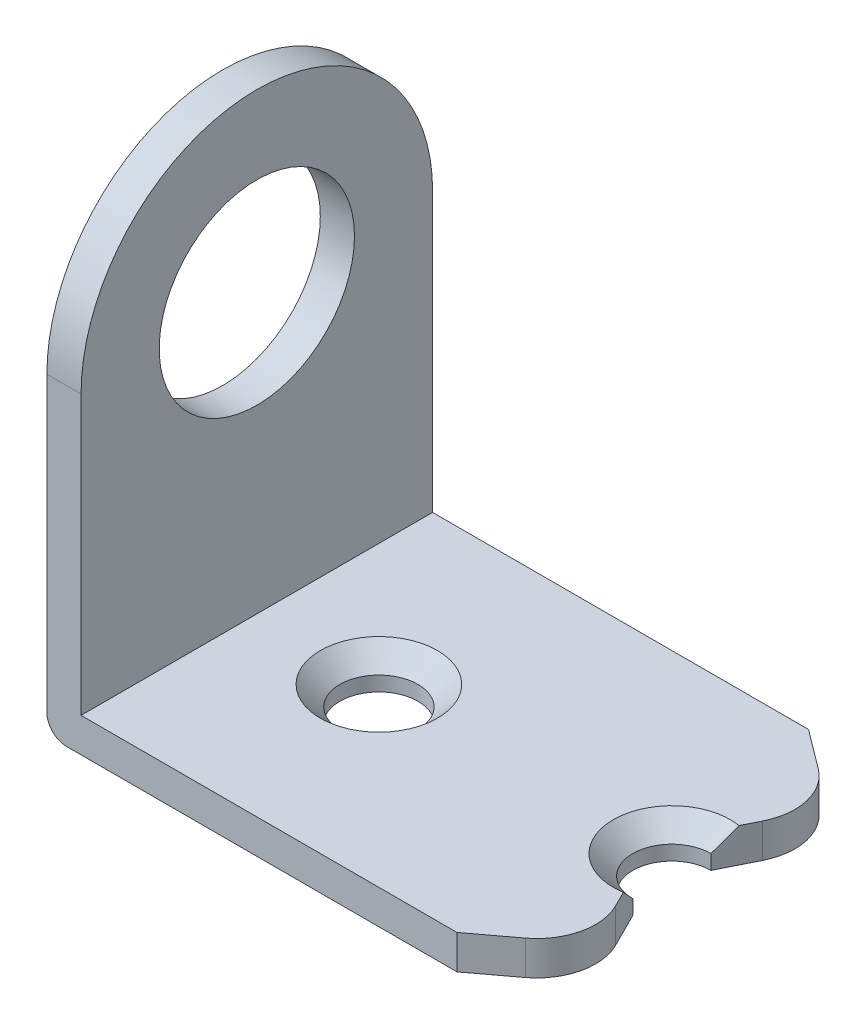
ISO-10303-21;
HEADER;
FILE_DESCRIPTION(('STEP AP214'),'2;1');
FILE_NAME('part.step','',(''),(''),'','','');
FILE_SCHEMA(('AUTOMOTIVE_DESIGN { 1 0 10303 214 1 1 1 1 }'));
ENDSEC;
DATA;
#1=APPLICATION_CONTEXT('core data for automotive mechanical design processes');
#2=APPLICATION_PROTOCOL_DEFINITION('international standard','automotive_design',2000,#1);
#3=PRODUCT_CONTEXT('',#1,'mechanical');
#4=PRODUCT('Part','Part','',(#3));
#5=PRODUCT_RELATED_PRODUCT_CATEGORY('part','',(#4));
#6=PRODUCT_DEFINITION_FORMATION('','',#4);
#7=PRODUCT_DEFINITION_CONTEXT('part definition',#1,'design');
#8=PRODUCT_DEFINITION('design','',#6,#7);
#9=PRODUCT_DEFINITION_SHAPE('','',#8);
#10=(LENGTH_UNIT() NAMED_UNIT(*) SI_UNIT(.MILLI.,.METRE.));
#11=(NAMED_UNIT(*) PLANE_ANGLE_UNIT() SI_UNIT($,.RADIAN.));
#12=(NAMED_UNIT(*) SI_UNIT($,.STERADIAN.) SOLID_ANGLE_UNIT());
#13=UNCERTAINTY_MEASURE_WITH_UNIT(LENGTH_MEASURE(1.E-05),#10,'distance_accuracy_value','');
#14=(GEOMETRIC_REPRESENTATION_CONTEXT(3) GLOBAL_UNCERTAINTY_ASSIGNED_CONTEXT((#13)) GLOBAL_UNIT_ASSIGNED_CONTEXT((#10,
#11,#12)) REPRESENTATION_CONTEXT('',''));
#15=CARTESIAN_POINT('',(0.,0.,0.));
#16=DIRECTION('',(0.,0.,1.));
#17=DIRECTION('',(1.,0.,0.));
#18=AXIS2_PLACEMENT_3D('',#15,#16,#17);
#19=CARTESIAN_POINT('',(1.,1.,9.));
#20=DIRECTION('',(0.,0.,-1.));
#21=DIRECTION('',(-1.,0.,0.));
#22=AXIS2_PLACEMENT_3D('',#19,#20,#21);
#23=CYLINDRICAL_SURFACE('',#22,1.);
#24=DIRECTION('',(0.,0.,1.));
#25=VECTOR('',#24,1.);
#26=CARTESIAN_POINT('',(0.,1.,9.));
#27=LINE('',#26,#25);
#28=CARTESIAN_POINT('',(0.,1.,-9.));
#29=VERTEX_POINT('',#28);
#30=CARTESIAN_POINT('',(0.,1.,9.));
#31=VERTEX_POINT('',#30);
#32=EDGE_CURVE('E187',#29,#31,#27,.T.);
#33=ORIENTED_EDGE('',*,*,#32,.F.);
#34=CARTESIAN_POINT('',(1.,1.,-9.));
#35=DIRECTION('',(0.,0.,1.));
#36=DIRECTION('',(1.,0.,0.));
#37=AXIS2_PLACEMENT_3D('',#34,#35,#36);
#38=CIRCLE('',#37,1.);
#39=CARTESIAN_POINT('',(1.,0.,-9.));
#40=VERTEX_POINT('',#39);
#41=EDGE_CURVE('E192',#40,#29,#38,.F.);
#42=ORIENTED_EDGE('',*,*,#41,.F.);
#43=DIRECTION('',(0.,0.,1.));
#44=VECTOR('',#43,1.);
#45=CARTESIAN_POINT('',(1.,0.,9.));
#46=LINE('',#45,#44);
#47=CARTESIAN_POINT('',(1.,0.,9.));
#48=VERTEX_POINT('',#47);
#49=EDGE_CURVE('E190',#48,#40,#46,.F.);
#50=ORIENTED_EDGE('',*,*,#49,.F.);
#51=CARTESIAN_POINT('',(1.,1.,9.));
#52=DIRECTION('',(0.,0.,-1.));
#53=DIRECTION('',(-1.,0.,0.));
#54=AXIS2_PLACEMENT_3D('',#51,#52,#53);
#55=CIRCLE('',#54,1.);
#56=EDGE_CURVE('E168',#31,#48,#55,.F.);
#57=ORIENTED_EDGE('',*,*,#56,.F.);
#58=EDGE_LOOP('',(#33,#42,#50,#57));
#59=FACE_BOUND('',#58,.T.);
#60=ADVANCED_FACE('F40',(#59),#23,.T.);
#61=CARTESIAN_POINT('',(0.,1.75,0.));
#62=DIRECTION('',(0.,-1.,0.));
#63=DIRECTION('',(0.,0.,-1.));
#64=AXIS2_PLACEMENT_3D('',#61,#62,#63);
#65=PLANE('',#64);
#66=CARTESIAN_POINT('',(8.,1.75,0.));
#67=DIRECTION('',(0.,-1.,0.));
#68=DIRECTION('',(0.,0.,-1.));
#69=AXIS2_PLACEMENT_3D('',#66,#67,#68);
#70=CIRCLE('',#69,3.00000000000002);
#71=CARTESIAN_POINT('',(8.,1.75,-3.00000000000003));
#72=VERTEX_POINT('',#71);
#73=EDGE_CURVE('E198',#72,#72,#70,.T.);
#74=ORIENTED_EDGE('',*,*,#73,.T.);
#75=EDGE_LOOP('',(#74));
#76=FACE_BOUND('',#75,.T.);
#77=CARTESIAN_POINT('',(21.1970167518184,1.75,-5.10223743613619));
#78=DIRECTION('',(0.,-1.,0.));
#79=DIRECTION('',(0.,0.,-1.));
#80=AXIS2_PLACEMENT_3D('',#77,#78,#79);
#81=CIRCLE('',#80,3.);
#82=CARTESIAN_POINT('',(22.9970167518184,1.75,-7.5022374361362));
#83=VERTEX_POINT('',#82);
#84=CARTESIAN_POINT('',(23.8802983248181,1.75,-3.76059664963631));
#85=VERTEX_POINT('',#84);
#86=EDGE_CURVE('E217',#83,#85,#81,.T.);
#87=ORIENTED_EDGE('',*,*,#86,.F.);
#88=DIRECTION('',(0.800000000000001,0.,0.599999999999999));
#89=VECTOR('',#88,1.);
#90=CARTESIAN_POINT('',(11.88,1.75,-15.84));
#91=LINE('',#90,#89);
#92=CARTESIAN_POINT('',(21.,1.75,-9.));
#93=VERTEX_POINT('',#92);
#94=EDGE_CURVE('E214',#93,#83,#91,.T.);
#95=ORIENTED_EDGE('',*,*,#94,.F.);
#96=DIRECTION('',(-1.,0.,0.));
#97=VECTOR('',#96,1.);
#98=CARTESIAN_POINT('',(0.,1.75,-9.));
#99=LINE('',#98,#97);
#100=CARTESIAN_POINT('',(1.75,1.75,-9.));
#101=VERTEX_POINT('',#100);
#102=EDGE_CURVE('E179',#93,#101,#99,.T.);
#103=ORIENTED_EDGE('',*,*,#102,.T.);
#104=DIRECTION('',(0.,0.,-1.));
#105=VECTOR('',#104,1.);
#106=CARTESIAN_POINT('',(1.75,1.75,0.));
#107=LINE('',#106,#105);
#108=CARTESIAN_POINT('',(1.75,1.75,9.));
#109=VERTEX_POINT('',#108);
#110=EDGE_CURVE('E445',#109,#101,#107,.T.);
#111=ORIENTED_EDGE('',*,*,#110,.F.);
#112=DIRECTION('',(1.,0.,0.));
#113=VECTOR('',#112,1.);
#114=CARTESIAN_POINT('',(0.,1.75,9.));
#115=LINE('',#114,#113);
#116=CARTESIAN_POINT('',(21.,1.75,9.));
#117=VERTEX_POINT('',#116);
#118=EDGE_CURVE('E173',#109,#117,#115,.T.);
#119=ORIENTED_EDGE('',*,*,#118,.T.);
#120=DIRECTION('',(-0.800000000000001,0.,0.599999999999999));
#121=VECTOR('',#120,1.);
#122=CARTESIAN_POINT('',(11.88,1.75,15.84));
#123=LINE('',#122,#121);
#124=CARTESIAN_POINT('',(22.9970167518184,1.75,7.50223743613621));
#125=VERTEX_POINT('',#124);
#126=EDGE_CURVE('E147',#125,#117,#123,.T.);
#127=ORIENTED_EDGE('',*,*,#126,.F.);
#128=CARTESIAN_POINT('',(21.1970167518184,1.75,5.10223743613619));
#129=DIRECTION('',(0.,-1.,0.));
#130=DIRECTION('',(0.,0.,-1.));
#131=AXIS2_PLACEMENT_3D('',#128,#129,#130);
#132=CIRCLE('',#131,3.);
#133=CARTESIAN_POINT('',(23.8802983248181,1.75,3.76059664963631));
#134=VERTEX_POINT('',#133);
#135=EDGE_CURVE('E439',#134,#125,#132,.T.);
#136=ORIENTED_EDGE('',*,*,#135,.F.);
#137=DIRECTION('',(0.447213595499958,0.,0.894427190999916));
#138=VECTOR('',#137,1.);
#139=CARTESIAN_POINT('',(17.6,1.75,-8.8));
#140=LINE('',#139,#138);
#141=CARTESIAN_POINT('',(23.4806248474866,1.75,2.96124969497316));
#142=VERTEX_POINT('',#141);
#143=EDGE_CURVE('E208',#142,#134,#140,.T.);
#144=ORIENTED_EDGE('',*,*,#143,.F.);
#145=CARTESIAN_POINT('',(23.,1.75,0.));
#146=DIRECTION('',(0.,-1.,0.));
#147=DIRECTION('',(0.,0.,-1.));
#148=AXIS2_PLACEMENT_3D('',#145,#146,#147);
#149=CIRCLE('',#148,3.00000000000002);
#150=CARTESIAN_POINT('',(23.4806248474866,1.75,-2.96124969497316));
#151=VERTEX_POINT('',#150);
#152=EDGE_CURVE('E48',#142,#151,#149,.T.);
#153=ORIENTED_EDGE('',*,*,#152,.T.);
#154=DIRECTION('',(-0.447213595499958,0.,0.894427190999916));
#155=VECTOR('',#154,1.);
#156=CARTESIAN_POINT('',(17.6,1.75,8.8));
#157=LINE('',#156,#155);
#158=EDGE_CURVE('E63',#85,#151,#157,.T.);
#159=ORIENTED_EDGE('',*,*,#158,.F.);
#160=EDGE_LOOP('',(#87,#95,#103,#111,#119,#127,#136,#144,#153,#159));
#161=FACE_BOUND('',#160,.T.);
#162=ADVANCED_FACE('F205',(#76,#161),#65,.F.);
#163=CARTESIAN_POINT('',(0.,0.,0.));
#164=DIRECTION('',(0.,-1.,0.));
#165=DIRECTION('',(0.,0.,-1.));
#166=AXIS2_PLACEMENT_3D('',#163,#164,#165);
#167=PLANE('',#166);
#168=DIRECTION('',(-0.800000000000001,0.,-0.599999999999999));
#169=VECTOR('',#168,1.);
#170=CARTESIAN_POINT('',(11.88,0.,-15.84));
#171=LINE('',#170,#169);
#172=CARTESIAN_POINT('',(22.9970167518184,0.,-7.5022374361362));
#173=VERTEX_POINT('',#172);
#174=CARTESIAN_POINT('',(21.,0.,-9.));
#175=VERTEX_POINT('',#174);
#176=EDGE_CURVE('E152',#173,#175,#171,.T.);
#177=ORIENTED_EDGE('',*,*,#176,.F.);
#178=CARTESIAN_POINT('',(21.1970167518184,0.,-5.10223743613619));
#179=DIRECTION('',(0.,-1.,0.));
#180=DIRECTION('',(0.,0.,-1.));
#181=AXIS2_PLACEMENT_3D('',#178,#179,#180);
#182=CIRCLE('',#181,3.);
#183=CARTESIAN_POINT('',(23.8802983248181,0.,-3.76059664963631));
#184=VERTEX_POINT('',#183);
#185=EDGE_CURVE('E498',#184,#173,#182,.F.);
#186=ORIENTED_EDGE('',*,*,#185,.F.);
#187=DIRECTION('',(0.447213595499958,0.,-0.894427190999916));
#188=VECTOR('',#187,1.);
#189=CARTESIAN_POINT('',(17.6,0.,8.8));
#190=LINE('',#189,#188);
#191=CARTESIAN_POINT('',(23.,0.,-2.00000000000001));
#192=VERTEX_POINT('',#191);
#193=EDGE_CURVE('E496',#192,#184,#190,.T.);
#194=ORIENTED_EDGE('',*,*,#193,.F.);
#195=CARTESIAN_POINT('',(23.,0.,0.));
#196=DIRECTION('',(0.,1.,0.));
#197=DIRECTION('',(0.,0.,1.));
#198=AXIS2_PLACEMENT_3D('',#195,#196,#197);
#199=CIRCLE('',#198,2.);
#200=CARTESIAN_POINT('',(23.,0.,2.));
#201=VERTEX_POINT('',#200);
#202=EDGE_CURVE('E176',#192,#201,#199,.T.);
#203=ORIENTED_EDGE('',*,*,#202,.T.);
#204=DIRECTION('',(-0.447213595499958,0.,-0.894427190999916));
#205=VECTOR('',#204,1.);
#206=CARTESIAN_POINT('',(17.6,0.,-8.8));
#207=LINE('',#206,#205);
#208=CARTESIAN_POINT('',(23.8802983248181,0.,3.76059664963631));
#209=VERTEX_POINT('',#208);
#210=EDGE_CURVE('E493',#209,#201,#207,.T.);
#211=ORIENTED_EDGE('',*,*,#210,.F.);
#212=CARTESIAN_POINT('',(21.1970167518184,0.,5.10223743613619));
#213=DIRECTION('',(0.,-1.,0.));
#214=DIRECTION('',(0.,0.,-1.));
#215=AXIS2_PLACEMENT_3D('',#212,#213,#214);
#216=CIRCLE('',#215,3.);
#217=CARTESIAN_POINT('',(22.9970167518184,0.,7.50223743613621));
#218=VERTEX_POINT('',#217);
#219=EDGE_CURVE('E163',#218,#209,#216,.F.);
#220=ORIENTED_EDGE('',*,*,#219,.F.);
#221=DIRECTION('',(0.800000000000001,0.,-0.599999999999999));
#222=VECTOR('',#221,1.);
#223=CARTESIAN_POINT('',(11.88,0.,15.84));
#224=LINE('',#223,#222);
#225=CARTESIAN_POINT('',(21.,0.,9.));
#226=VERTEX_POINT('',#225);
#227=EDGE_CURVE('E144',#226,#218,#224,.T.);
#228=ORIENTED_EDGE('',*,*,#227,.F.);
#229=DIRECTION('',(1.,0.,0.));
#230=VECTOR('',#229,1.);
#231=CARTESIAN_POINT('',(0.,0.,9.));
#232=LINE('',#231,#230);
#233=EDGE_CURVE('E160',#48,#226,#232,.T.);
#234=ORIENTED_EDGE('',*,*,#233,.F.);
#235=ORIENTED_EDGE('',*,*,#49,.T.);
#236=DIRECTION('',(-1.,0.,0.));
#237=VECTOR('',#236,1.);
#238=CARTESIAN_POINT('',(0.,0.,-9.));
#239=LINE('',#238,#237);
#240=EDGE_CURVE('E170',#175,#40,#239,.T.);
#241=ORIENTED_EDGE('',*,*,#240,.F.);
#242=EDGE_LOOP('',(#177,#186,#194,#203,#211,#220,#228,#234,#235,#241));
#243=FACE_BOUND('',#242,.T.);
#244=CARTESIAN_POINT('',(8.,0.,0.));
#245=DIRECTION('',(0.,1.,0.));
#246=DIRECTION('',(0.,0.,1.));
#247=AXIS2_PLACEMENT_3D('',#244,#245,#246);
#248=CIRCLE('',#247,2.);
#249=CARTESIAN_POINT('',(8.,0.,2.));
#250=VERTEX_POINT('',#249);
#251=EDGE_CURVE('E171',#250,#250,#248,.T.);
#252=ORIENTED_EDGE('',*,*,#251,.T.);
#253=EDGE_LOOP('',(#252));
#254=FACE_BOUND('',#253,.T.);
#255=ADVANCED_FACE('F157',(#243,#254),#167,.T.);
#256=CARTESIAN_POINT('',(0.,1.75,9.));
#257=DIRECTION('',(1.,0.,0.));
#258=DIRECTION('',(0.,0.,-1.));
#259=AXIS2_PLACEMENT_3D('',#256,#257,#258);
#260=PLANE('',#259);
#261=DIRECTION('',(0.,-1.,0.));
#262=VECTOR('',#261,1.);
#263=CARTESIAN_POINT('',(0.,1.75,-9.));
#264=LINE('',#263,#262);
#265=CARTESIAN_POINT('',(0.,16.,-9.));
#266=VERTEX_POINT('',#265);
#267=EDGE_CURVE('E182',#266,#29,#264,.T.);
#268=ORIENTED_EDGE('',*,*,#267,.T.);
#269=ORIENTED_EDGE('',*,*,#32,.T.);
#270=DIRECTION('',(0.,-1.,0.));
#271=VECTOR('',#270,1.);
#272=CARTESIAN_POINT('',(0.,1.75,9.));
#273=LINE('',#272,#271);
#274=CARTESIAN_POINT('',(0.,16.,9.));
#275=VERTEX_POINT('',#274);
#276=EDGE_CURVE('E185',#275,#31,#273,.T.);
#277=ORIENTED_EDGE('',*,*,#276,.F.);
#278=CARTESIAN_POINT('',(0.,16.,0.));
#279=DIRECTION('',(1.,0.,0.));
#280=DIRECTION('',(0.,0.,1.));
#281=AXIS2_PLACEMENT_3D('',#278,#279,#280);
#282=CIRCLE('',#281,9.);
#283=EDGE_CURVE('E459',#266,#275,#282,.T.);
#284=ORIENTED_EDGE('',*,*,#283,.F.);
#285=EDGE_LOOP('',(#268,#269,#277,#284));
#286=FACE_BOUND('',#285,.T.);
#287=CARTESIAN_POINT('',(0.,16.,0.));
#288=DIRECTION('',(1.,0.,0.));
#289=DIRECTION('',(0.,0.,-1.));
#290=AXIS2_PLACEMENT_3D('',#287,#288,#289);
#291=CIRCLE('',#290,5.);
#292=CARTESIAN_POINT('',(0.,16.,-5.));
#293=VERTEX_POINT('',#292);
#294=EDGE_CURVE('E241',#293,#293,#291,.T.);
#295=ORIENTED_EDGE('',*,*,#294,.T.);
#296=EDGE_LOOP('',(#295));
#297=FACE_BOUND('',#296,.T.);
#298=ADVANCED_FACE('F282',(#286,#297),#260,.F.);
#299=CARTESIAN_POINT('',(0.,1.75,9.));
#300=DIRECTION('',(0.,0.,-1.));
#301=DIRECTION('',(-1.,0.,0.));
#302=AXIS2_PLACEMENT_3D('',#299,#300,#301);
#303=PLANE('',#302);
#304=ORIENTED_EDGE('',*,*,#233,.T.);
#305=DIRECTION('',(0.,-1.,0.));
#306=VECTOR('',#305,1.);
#307=CARTESIAN_POINT('',(21.,25.001,9.));
#308=LINE('',#307,#306);
#309=EDGE_CURVE('E141',#117,#226,#308,.T.);
#310=ORIENTED_EDGE('',*,*,#309,.F.);
#311=ORIENTED_EDGE('',*,*,#118,.F.);
#312=DIRECTION('',(0.,-1.,0.));
#313=VECTOR('',#312,1.);
#314=CARTESIAN_POINT('',(1.75,0.,9.));
#315=LINE('',#314,#313);
#316=CARTESIAN_POINT('',(1.75,16.,9.));
#317=VERTEX_POINT('',#316);
#318=EDGE_CURVE('E458',#317,#109,#315,.T.);
#319=ORIENTED_EDGE('',*,*,#318,.F.);
#320=DIRECTION('',(-1.,0.,0.));
#321=VECTOR('',#320,1.);
#322=CARTESIAN_POINT('',(1.75,16.,9.));
#323=LINE('',#322,#321);
#324=EDGE_CURVE('E455',#317,#275,#323,.T.);
#325=ORIENTED_EDGE('',*,*,#324,.T.);
#326=ORIENTED_EDGE('',*,*,#276,.T.);
#327=ORIENTED_EDGE('',*,*,#56,.T.);
#328=EDGE_LOOP('',(#304,#310,#311,#319,#325,#326,#327));
#329=FACE_BOUND('',#328,.T.);
#330=ADVANCED_FACE('F166',(#329),#303,.F.);
#331=CARTESIAN_POINT('',(0.,1.75,-9.));
#332=DIRECTION('',(0.,0.,1.));
#333=DIRECTION('',(1.,0.,0.));
#334=AXIS2_PLACEMENT_3D('',#331,#332,#333);
#335=PLANE('',#334);
#336=ORIENTED_EDGE('',*,*,#102,.F.);
#337=DIRECTION('',(0.,-1.,0.));
#338=VECTOR('',#337,1.);
#339=CARTESIAN_POINT('',(21.,25.001,-9.));
#340=LINE('',#339,#338);
#341=EDGE_CURVE('E242',#93,#175,#340,.T.);
#342=ORIENTED_EDGE('',*,*,#341,.T.);
#343=ORIENTED_EDGE('',*,*,#240,.T.);
#344=ORIENTED_EDGE('',*,*,#41,.T.);
#345=ORIENTED_EDGE('',*,*,#267,.F.);
#346=DIRECTION('',(-1.,0.,0.));
#347=VECTOR('',#346,1.);
#348=CARTESIAN_POINT('',(1.75,16.,-9.));
#349=LINE('',#348,#347);
#350=CARTESIAN_POINT('',(1.75,16.,-9.));
#351=VERTEX_POINT('',#350);
#352=EDGE_CURVE('E452',#351,#266,#349,.T.);
#353=ORIENTED_EDGE('',*,*,#352,.F.);
#354=DIRECTION('',(0.,1.,0.));
#355=VECTOR('',#354,1.);
#356=CARTESIAN_POINT('',(1.75,0.,-9.));
#357=LINE('',#356,#355);
#358=EDGE_CURVE('E462',#101,#351,#357,.T.);
#359=ORIENTED_EDGE('',*,*,#358,.F.);
#360=EDGE_LOOP('',(#336,#342,#343,#344,#345,#353,#359));
#361=FACE_BOUND('',#360,.T.);
#362=ADVANCED_FACE('F275',(#361),#335,.F.);
#363=CARTESIAN_POINT('',(8.,1.75,0.));
#364=DIRECTION('',(0.,-1.,0.));
#365=DIRECTION('',(0.,0.,-1.));
#366=AXIS2_PLACEMENT_3D('',#363,#364,#365);
#367=CYLINDRICAL_SURFACE('',#366,2.);
#368=CARTESIAN_POINT('',(8.,0.749999999999987,0.));
#369=DIRECTION('',(0.,-1.,0.));
#370=DIRECTION('',(0.,0.,-1.));
#371=AXIS2_PLACEMENT_3D('',#368,#369,#370);
#372=CIRCLE('',#371,2.);
#373=CARTESIAN_POINT('',(8.,0.749999999999987,-2.));
#374=VERTEX_POINT('',#373);
#375=EDGE_CURVE('E11',#374,#374,#372,.F.);
#376=ORIENTED_EDGE('',*,*,#375,.T.);
#377=EDGE_LOOP('',(#376));
#378=FACE_BOUND('',#377,.T.);
#379=ORIENTED_EDGE('',*,*,#251,.F.);
#380=EDGE_LOOP('',(#379));
#381=FACE_BOUND('',#380,.T.);
#382=ADVANCED_FACE('F271',(#378,#381),#367,.F.);
#383=CARTESIAN_POINT('',(23.,1.75,0.));
#384=DIRECTION('',(0.,-1.,0.));
#385=DIRECTION('',(0.,0.,-1.));
#386=AXIS2_PLACEMENT_3D('',#383,#384,#385);
#387=CYLINDRICAL_SURFACE('',#386,2.);
#388=DIRECTION('',(0.,-1.,0.));
#389=VECTOR('',#388,1.);
#390=CARTESIAN_POINT('',(23.,25.001,-2.00000000000001));
#391=LINE('',#390,#389);
#392=CARTESIAN_POINT('',(23.,0.74999999999999,-2.00000000000001));
#393=VERTEX_POINT('',#392);
#394=EDGE_CURVE('E490',#393,#192,#391,.T.);
#395=ORIENTED_EDGE('',*,*,#394,.F.);
#396=CARTESIAN_POINT('',(23.,0.74999999999999,0.));
#397=DIRECTION('',(0.,-1.,0.));
#398=DIRECTION('',(0.,0.,-1.));
#399=AXIS2_PLACEMENT_3D('',#396,#397,#398);
#400=CIRCLE('',#399,2.);
#401=CARTESIAN_POINT('',(23.,0.74999999999999,2.));
#402=VERTEX_POINT('',#401);
#403=EDGE_CURVE('E195',#393,#402,#400,.F.);
#404=ORIENTED_EDGE('',*,*,#403,.T.);
#405=DIRECTION('',(0.,-1.,0.));
#406=VECTOR('',#405,1.);
#407=CARTESIAN_POINT('',(23.,25.001,2.));
#408=LINE('',#407,#406);
#409=EDGE_CURVE('E55',#402,#201,#408,.T.);
#410=ORIENTED_EDGE('',*,*,#409,.T.);
#411=ORIENTED_EDGE('',*,*,#202,.F.);
#412=EDGE_LOOP('',(#395,#404,#410,#411));
#413=FACE_BOUND('',#412,.T.);
#414=ADVANCED_FACE('F264',(#413),#387,.F.);
#415=CARTESIAN_POINT('',(1.75,16.,0.));
#416=DIRECTION('',(-1.,0.,0.));
#417=DIRECTION('',(0.,0.,1.));
#418=AXIS2_PLACEMENT_3D('',#415,#416,#417);
#419=PLANE('',#418);
#420=CARTESIAN_POINT('',(1.75,16.,0.));
#421=DIRECTION('',(1.,0.,0.));
#422=DIRECTION('',(0.,0.,-1.));
#423=AXIS2_PLACEMENT_3D('',#420,#421,#422);
#424=CIRCLE('',#423,5.);
#425=CARTESIAN_POINT('',(1.75,16.,-5.));
#426=VERTEX_POINT('',#425);
#427=EDGE_CURVE('E244',#426,#426,#424,.T.);
#428=ORIENTED_EDGE('',*,*,#427,.F.);
#429=EDGE_LOOP('',(#428));
#430=FACE_BOUND('',#429,.T.);
#431=ORIENTED_EDGE('',*,*,#318,.T.);
#432=ORIENTED_EDGE('',*,*,#110,.T.);
#433=ORIENTED_EDGE('',*,*,#358,.T.);
#434=CARTESIAN_POINT('',(1.75,16.,0.));
#435=DIRECTION('',(1.,0.,0.));
#436=DIRECTION('',(0.,0.,1.));
#437=AXIS2_PLACEMENT_3D('',#434,#435,#436);
#438=CIRCLE('',#437,9.);
#439=EDGE_CURVE('E464',#351,#317,#438,.T.);
#440=ORIENTED_EDGE('',*,*,#439,.T.);
#441=EDGE_LOOP('',(#431,#432,#433,#440));
#442=FACE_BOUND('',#441,.T.);
#443=ADVANCED_FACE('F261',(#430,#442),#419,.F.);
#444=CARTESIAN_POINT('',(1.75,16.,0.));
#445=DIRECTION('',(-1.,0.,0.));
#446=DIRECTION('',(0.,0.,1.));
#447=AXIS2_PLACEMENT_3D('',#444,#445,#446);
#448=CYLINDRICAL_SURFACE('',#447,9.);
#449=ORIENTED_EDGE('',*,*,#283,.T.);
#450=ORIENTED_EDGE('',*,*,#324,.F.);
#451=ORIENTED_EDGE('',*,*,#439,.F.);
#452=ORIENTED_EDGE('',*,*,#352,.T.);
#453=EDGE_LOOP('',(#449,#450,#451,#452));
#454=FACE_BOUND('',#453,.T.);
#455=ADVANCED_FACE('F259',(#454),#448,.T.);
#456=CARTESIAN_POINT('',(1.75,16.,0.));
#457=DIRECTION('',(-1.,0.,0.));
#458=DIRECTION('',(0.,0.,1.));
#459=AXIS2_PLACEMENT_3D('',#456,#457,#458);
#460=CYLINDRICAL_SURFACE('',#459,5.);
#461=ORIENTED_EDGE('',*,*,#427,.T.);
#462=EDGE_LOOP('',(#461));
#463=FACE_BOUND('',#462,.T.);
#464=ORIENTED_EDGE('',*,*,#294,.F.);
#465=EDGE_LOOP('',(#464));
#466=FACE_BOUND('',#465,.T.);
#467=ADVANCED_FACE('F256',(#463,#466),#460,.F.);
#468=CARTESIAN_POINT('',(23.,0.74999999999999,0.));
#469=DIRECTION('',(0.,1.,0.));
#470=DIRECTION('',(0.,0.,1.));
#471=AXIS2_PLACEMENT_3D('',#468,#469,#470);
#472=CONICAL_SURFACE('',#471,2.,0.785398163397453);
#473=CARTESIAN_POINT('',(22.9998999987498,0.749799999999996,-1.9997999974997));
#474=CARTESIAN_POINT('',(23.0406871645309,0.831425695175156,-2.08137432906177));
#475=CARTESIAN_POINT('',(23.0812199646508,0.913679422788214,-2.16243992930159));
#476=CARTESIAN_POINT('',(23.1618940962232,1.0791311912948,-2.32378819244635));
#477=CARTESIAN_POINT('',(23.2020354516089,1.16232917377429,-2.40407090321772));
#478=CARTESIAN_POINT('',(23.2820476048845,1.32936502065923,-2.564095209769));
#479=CARTESIAN_POINT('',(23.3219184117996,1.41320286351958,-2.64383682359916));
#480=CARTESIAN_POINT('',(23.4014562124534,1.58137157179625,-2.80291242490671));
#481=CARTESIAN_POINT('',(23.4411231937321,1.66570246669497,-2.88224638746416));
#482=CARTESIAN_POINT('',(23.480718551439,1.75019999999995,-2.96143710287806));
#483=B_SPLINE_CURVE_WITH_KNOTS('',3,(#473,#474,#475,#476,#477,#478,#479,#480,#481,#482),
.UNSPECIFIED.,.F.,.F.,(4,2,2,2,4),(0.,0.367177217822567,0.734331843603105,1.10147416078496,
1.46863866073598),.UNSPECIFIED.);
#484=EDGE_CURVE('E164',#393,#151,#483,.T.);
#485=ORIENTED_EDGE('',*,*,#484,.T.);
#486=ORIENTED_EDGE('',*,*,#152,.F.);
#487=CARTESIAN_POINT('',(23.480718551439,1.7502,2.96143710287801));
#488=CARTESIAN_POINT('',(23.4411231937321,1.66570246669499,2.88224638746414));
#489=CARTESIAN_POINT('',(23.4014562124534,1.58137157179626,2.8029124249067));
#490=CARTESIAN_POINT('',(23.3219184117996,1.41320286351958,2.64383682359917));
#491=CARTESIAN_POINT('',(23.2820476048845,1.32936502065923,2.56409520976899));
#492=CARTESIAN_POINT('',(23.2020354516089,1.1623291737743,2.40407090321772));
#493=CARTESIAN_POINT('',(23.1618940962232,1.0791311912948,2.32378819244635));
#494=CARTESIAN_POINT('',(23.0812199646508,0.913679422788214,2.16243992930159));
#495=CARTESIAN_POINT('',(23.0406871645309,0.831425695175155,2.08137432906177));
#496=CARTESIAN_POINT('',(22.9998999987498,0.749799999999996,1.99979999749969));
#497=B_SPLINE_CURVE_WITH_KNOTS('',3,(#487,#488,#489,#490,#491,#492,#493,#494,#495,#496),
.UNSPECIFIED.,.F.,.F.,(4,2,2,2,4),(0.,0.367164499951018,0.734306817132875,1.10146144291341,
1.46863866073598),.UNSPECIFIED.);
#498=EDGE_CURVE('E212',#142,#402,#497,.T.);
#499=ORIENTED_EDGE('',*,*,#498,.T.);
#500=ORIENTED_EDGE('',*,*,#403,.F.);
#501=EDGE_LOOP('',(#485,#486,#499,#500));
#502=FACE_BOUND('',#501,.T.);
#503=ADVANCED_FACE('F210',(#502),#472,.F.);
#504=CARTESIAN_POINT('',(8.,0.749999999999987,0.));
#505=DIRECTION('',(0.,1.,0.));
#506=DIRECTION('',(0.,0.,1.));
#507=AXIS2_PLACEMENT_3D('',#504,#505,#506);
#508=CONICAL_SURFACE('',#507,2.,0.785398163397454);
#509=ORIENTED_EDGE('',*,*,#73,.F.);
#510=EDGE_LOOP('',(#509));
#511=FACE_BOUND('',#510,.T.);
#512=ORIENTED_EDGE('',*,*,#375,.F.);
#513=EDGE_LOOP('',(#512));
#514=FACE_BOUND('',#513,.T.);
#515=ADVANCED_FACE('F42',(#511,#514),#508,.F.);
#516=CARTESIAN_POINT('',(11.88,25.001,15.84));
#517=DIRECTION('',(-0.599999999999999,0.,-0.800000000000001));
#518=DIRECTION('',(-0.800000000000001,0.,0.599999999999999));
#519=AXIS2_PLACEMENT_3D('',#516,#517,#518);
#520=PLANE('',#519);
#521=ORIENTED_EDGE('',*,*,#126,.T.);
#522=ORIENTED_EDGE('',*,*,#309,.T.);
#523=ORIENTED_EDGE('',*,*,#227,.T.);
#524=DIRECTION('',(0.,-1.,0.));
#525=VECTOR('',#524,1.);
#526=CARTESIAN_POINT('',(22.9970167518184,25.001,7.50223743613621));
#527=LINE('',#526,#525);
#528=EDGE_CURVE('E151',#125,#218,#527,.T.);
#529=ORIENTED_EDGE('',*,*,#528,.F.);
#530=EDGE_LOOP('',(#521,#522,#523,#529));
#531=FACE_BOUND('',#530,.T.);
#532=ADVANCED_FACE('F143',(#531),#520,.F.);
#533=CARTESIAN_POINT('',(17.6,25.001,-8.8));
#534=DIRECTION('',(-0.894427190999916,0.,0.447213595499958));
#535=DIRECTION('',(0.447213595499958,0.,0.894427190999916));
#536=AXIS2_PLACEMENT_3D('',#533,#534,#535);
#537=PLANE('',#536);
#538=ORIENTED_EDGE('',*,*,#143,.T.);
#539=DIRECTION('',(0.,-1.,0.));
#540=VECTOR('',#539,1.);
#541=CARTESIAN_POINT('',(23.8802983248181,25.001,3.76059664963631));
#542=LINE('',#541,#540);
#543=EDGE_CURVE('E442',#134,#209,#542,.T.);
#544=ORIENTED_EDGE('',*,*,#543,.T.);
#545=ORIENTED_EDGE('',*,*,#210,.T.);
#546=ORIENTED_EDGE('',*,*,#409,.F.);
#547=ORIENTED_EDGE('',*,*,#498,.F.);
#548=EDGE_LOOP('',(#538,#544,#545,#546,#547));
#549=FACE_BOUND('',#548,.T.);
#550=ADVANCED_FACE('F246',(#549),#537,.F.);
#551=CARTESIAN_POINT('',(21.1970167518184,25.001,5.10223743613619));
#552=DIRECTION('',(0.,-1.,0.));
#553=DIRECTION('',(0.,0.,-1.));
#554=AXIS2_PLACEMENT_3D('',#551,#552,#553);
#555=CYLINDRICAL_SURFACE('',#554,3.);
#556=ORIENTED_EDGE('',*,*,#135,.T.);
#557=ORIENTED_EDGE('',*,*,#528,.T.);
#558=ORIENTED_EDGE('',*,*,#219,.T.);
#559=ORIENTED_EDGE('',*,*,#543,.F.);
#560=EDGE_LOOP('',(#556,#557,#558,#559));
#561=FACE_BOUND('',#560,.T.);
#562=ADVANCED_FACE('F250',(#561),#555,.T.);
#563=CARTESIAN_POINT('',(11.88,25.001,-15.84));
#564=DIRECTION('',(-0.599999999999999,0.,0.800000000000001));
#565=DIRECTION('',(0.800000000000001,0.,0.599999999999999));
#566=AXIS2_PLACEMENT_3D('',#563,#564,#565);
#567=PLANE('',#566);
#568=ORIENTED_EDGE('',*,*,#94,.T.);
#569=DIRECTION('',(0.,-1.,0.));
#570=VECTOR('',#569,1.);
#571=CARTESIAN_POINT('',(22.9970167518184,25.001,-7.5022374361362));
#572=LINE('',#571,#570);
#573=EDGE_CURVE('E434',#83,#173,#572,.T.);
#574=ORIENTED_EDGE('',*,*,#573,.T.);
#575=ORIENTED_EDGE('',*,*,#176,.T.);
#576=ORIENTED_EDGE('',*,*,#341,.F.);
#577=EDGE_LOOP('',(#568,#574,#575,#576));
#578=FACE_BOUND('',#577,.T.);
#579=ADVANCED_FACE('F233',(#578),#567,.F.);
#580=CARTESIAN_POINT('',(21.1970167518184,25.001,-5.10223743613619));
#581=DIRECTION('',(0.,-1.,0.));
#582=DIRECTION('',(0.,0.,-1.));
#583=AXIS2_PLACEMENT_3D('',#580,#581,#582);
#584=CYLINDRICAL_SURFACE('',#583,3.);
#585=ORIENTED_EDGE('',*,*,#86,.T.);
#586=DIRECTION('',(0.,-1.,0.));
#587=VECTOR('',#586,1.);
#588=CARTESIAN_POINT('',(23.8802983248181,25.001,-3.76059664963631));
#589=LINE('',#588,#587);
#590=EDGE_CURVE('E432',#85,#184,#589,.T.);
#591=ORIENTED_EDGE('',*,*,#590,.T.);
#592=ORIENTED_EDGE('',*,*,#185,.T.);
#593=ORIENTED_EDGE('',*,*,#573,.F.);
#594=EDGE_LOOP('',(#585,#591,#592,#593));
#595=FACE_BOUND('',#594,.T.);
#596=ADVANCED_FACE('F325',(#595),#584,.T.);
#597=CARTESIAN_POINT('',(17.6,25.001,8.8));
#598=DIRECTION('',(-0.894427190999916,0.,-0.447213595499958));
#599=DIRECTION('',(-0.447213595499958,0.,0.894427190999916));
#600=AXIS2_PLACEMENT_3D('',#597,#598,#599);
#601=PLANE('',#600);
#602=ORIENTED_EDGE('',*,*,#158,.T.);
#603=ORIENTED_EDGE('',*,*,#484,.F.);
#604=ORIENTED_EDGE('',*,*,#394,.T.);
#605=ORIENTED_EDGE('',*,*,#193,.T.);
#606=ORIENTED_EDGE('',*,*,#590,.F.);
#607=EDGE_LOOP('',(#602,#603,#604,#605,#606));
#608=FACE_BOUND('',#607,.T.);
#609=ADVANCED_FACE('F227',(#608),#601,.F.);
#610=CLOSED_SHELL('',(#60,#162,#255,#298,#330,#362,#382,#414,#443,#455,#467,#503,#515,#532,#550,
#562,#579,#596,#609));
#611=MANIFOLD_SOLID_BREP('B2',#610);
#612=ADVANCED_BREP_SHAPE_REPRESENTATION('',(#18,#611),#14);
#613=SHAPE_DEFINITION_REPRESENTATION(#9,#612);
ENDSEC;
END-ISO-10303-21;
